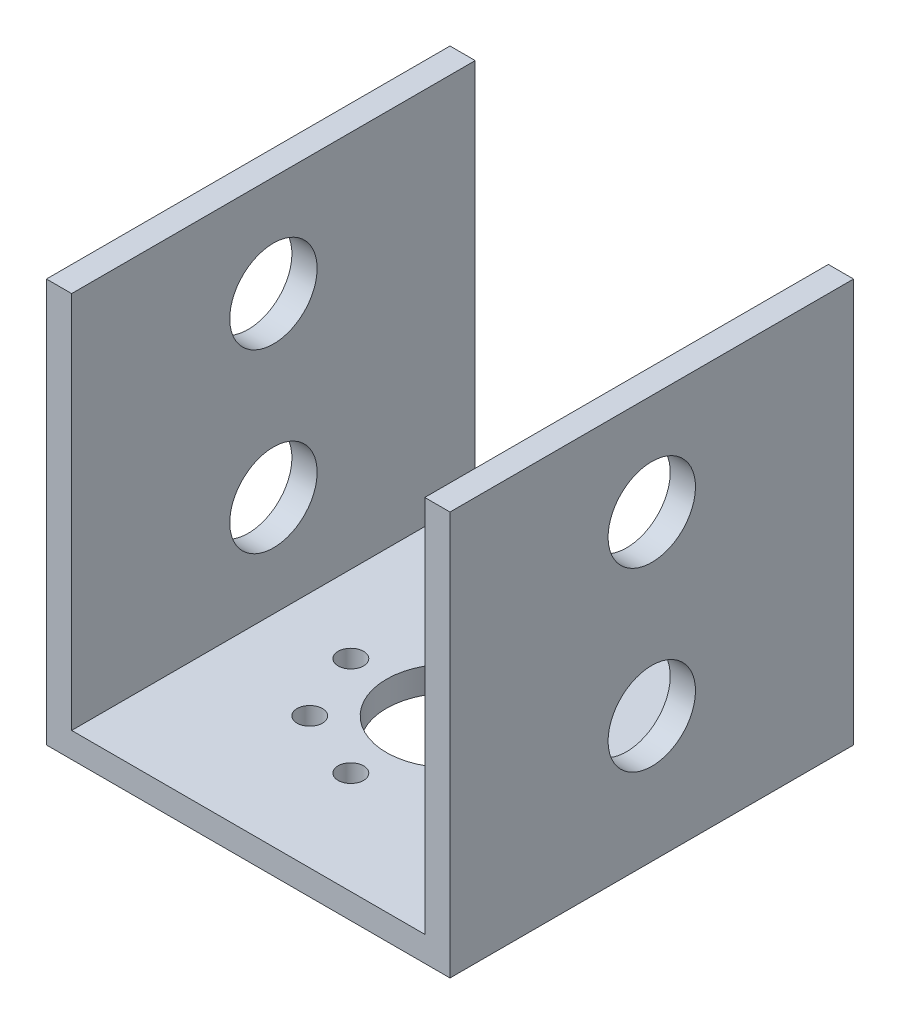
ISO-10303-21;
HEADER;
FILE_DESCRIPTION(('STEP AP214'),'2;1');
FILE_NAME('part.step','',(''),(''),'','','');
FILE_SCHEMA(('AUTOMOTIVE_DESIGN { 1 0 10303 214 1 1 1 1 }'));
ENDSEC;
DATA;
#1=APPLICATION_CONTEXT('core data for automotive mechanical design processes');
#2=APPLICATION_PROTOCOL_DEFINITION('international standard','automotive_design',2000,#1);
#3=PRODUCT_CONTEXT('',#1,'mechanical');
#4=PRODUCT('Part','Part','',(#3));
#5=PRODUCT_RELATED_PRODUCT_CATEGORY('part','',(#4));
#6=PRODUCT_DEFINITION_FORMATION('','',#4);
#7=PRODUCT_DEFINITION_CONTEXT('part definition',#1,'design');
#8=PRODUCT_DEFINITION('design','',#6,#7);
#9=PRODUCT_DEFINITION_SHAPE('','',#8);
#10=(LENGTH_UNIT() NAMED_UNIT(*) SI_UNIT(.MILLI.,.METRE.));
#11=(NAMED_UNIT(*) PLANE_ANGLE_UNIT() SI_UNIT($,.RADIAN.));
#12=(NAMED_UNIT(*) SI_UNIT($,.STERADIAN.) SOLID_ANGLE_UNIT());
#13=UNCERTAINTY_MEASURE_WITH_UNIT(LENGTH_MEASURE(1.E-05),#10,'distance_accuracy_value','');
#14=(GEOMETRIC_REPRESENTATION_CONTEXT(3) GLOBAL_UNCERTAINTY_ASSIGNED_CONTEXT((#13)) GLOBAL_UNIT_ASSIGNED_CONTEXT((#10,
#11,#12)) REPRESENTATION_CONTEXT('',''));
#15=CARTESIAN_POINT('',(0.,0.,0.));
#16=DIRECTION('',(0.,0.,1.));
#17=DIRECTION('',(1.,0.,0.));
#18=AXIS2_PLACEMENT_3D('',#15,#16,#17);
#19=CARTESIAN_POINT('',(11.1125,0.,25.4));
#20=DIRECTION('',(1.,0.,0.));
#21=DIRECTION('',(0.,0.,-1.));
#22=AXIS2_PLACEMENT_3D('',#19,#20,#21);
#23=PLANE('',#22);
#24=CARTESIAN_POINT('',(11.1125,17.4625,12.7));
#25=DIRECTION('',(1.,0.,0.));
#26=DIRECTION('',(0.,0.,-1.));
#27=AXIS2_PLACEMENT_3D('',#24,#25,#26);
#28=CIRCLE('',#27,2.75);
#29=CARTESIAN_POINT('',(11.1125,20.2125,12.7));
#30=VERTEX_POINT('',#29);
#31=EDGE_CURVE('E141',#30,#30,#28,.T.);
#32=ORIENTED_EDGE('',*,*,#31,.T.);
#33=EDGE_LOOP('',(#32));
#34=FACE_BOUND('',#33,.T.);
#35=CARTESIAN_POINT('',(11.1125,6.35,12.7));
#36=DIRECTION('',(1.,0.,0.));
#37=DIRECTION('',(0.,0.,-1.));
#38=AXIS2_PLACEMENT_3D('',#35,#36,#37);
#39=CIRCLE('',#38,2.75);
#40=CARTESIAN_POINT('',(11.1125,9.1,12.7));
#41=VERTEX_POINT('',#40);
#42=EDGE_CURVE('E190',#41,#41,#39,.T.);
#43=ORIENTED_EDGE('',*,*,#42,.T.);
#44=EDGE_LOOP('',(#43));
#45=FACE_BOUND('',#44,.T.);
#46=DIRECTION('',(0.,-1.,0.));
#47=VECTOR('',#46,1.);
#48=CARTESIAN_POINT('',(11.1125,0.,0.));
#49=LINE('',#48,#47);
#50=CARTESIAN_POINT('',(11.1125,23.8125,0.));
#51=VERTEX_POINT('',#50);
#52=CARTESIAN_POINT('',(11.1125,0.,0.));
#53=VERTEX_POINT('',#52);
#54=EDGE_CURVE('E137',#51,#53,#49,.T.);
#55=ORIENTED_EDGE('',*,*,#54,.T.);
#56=DIRECTION('',(0.,0.,-1.));
#57=VECTOR('',#56,1.);
#58=CARTESIAN_POINT('',(11.1125,0.,25.4));
#59=LINE('',#58,#57);
#60=CARTESIAN_POINT('',(11.1125,0.,25.4));
#61=VERTEX_POINT('',#60);
#62=EDGE_CURVE('E11',#61,#53,#59,.T.);
#63=ORIENTED_EDGE('',*,*,#62,.F.);
#64=DIRECTION('',(0.,-1.,0.));
#65=VECTOR('',#64,1.);
#66=CARTESIAN_POINT('',(11.1125,0.,25.4));
#67=LINE('',#66,#65);
#68=CARTESIAN_POINT('',(11.1125,23.8125,25.4));
#69=VERTEX_POINT('',#68);
#70=EDGE_CURVE('E152',#69,#61,#67,.T.);
#71=ORIENTED_EDGE('',*,*,#70,.F.);
#72=DIRECTION('',(0.,0.,-1.));
#73=VECTOR('',#72,1.);
#74=CARTESIAN_POINT('',(11.1125,23.8125,25.4));
#75=LINE('',#74,#73);
#76=EDGE_CURVE('E133',#69,#51,#75,.T.);
#77=ORIENTED_EDGE('',*,*,#76,.T.);
#78=EDGE_LOOP('',(#55,#63,#71,#77));
#79=FACE_BOUND('',#78,.T.);
#80=ADVANCED_FACE('F41',(#34,#45,#79),#23,.F.);
#81=CARTESIAN_POINT('',(-11.1125,0.,25.4));
#82=DIRECTION('',(0.,-1.,0.));
#83=DIRECTION('',(1.,0.,0.));
#84=AXIS2_PLACEMENT_3D('',#81,#82,#83);
#85=PLANE('',#84);
#86=CARTESIAN_POINT('',(0.,0.,6.45832603632909));
#87=DIRECTION('',(0.,1.,0.));
#88=DIRECTION('',(0.,0.,1.));
#89=AXIS2_PLACEMENT_3D('',#86,#87,#88);
#90=CIRCLE('',#89,0.799999999999999);
#91=CARTESIAN_POINT('',(0.,0.,7.25832603632909));
#92=VERTEX_POINT('',#91);
#93=EDGE_CURVE('E259',#92,#92,#90,.T.);
#94=ORIENTED_EDGE('',*,*,#93,.F.);
#95=EDGE_LOOP('',(#94));
#96=FACE_BOUND('',#95,.T.);
#97=CARTESIAN_POINT('',(4.41352998566722,0.,8.28647001433277));
#98=DIRECTION('',(0.,1.,0.));
#99=DIRECTION('',(0.,0.,1.));
#100=AXIS2_PLACEMENT_3D('',#97,#98,#99);
#101=CIRCLE('',#100,0.799999999999999);
#102=CARTESIAN_POINT('',(4.41352998566722,0.,9.08647001433277));
#103=VERTEX_POINT('',#102);
#104=EDGE_CURVE('E253',#103,#103,#101,.T.);
#105=ORIENTED_EDGE('',*,*,#104,.F.);
#106=EDGE_LOOP('',(#105));
#107=FACE_BOUND('',#106,.T.);
#108=CARTESIAN_POINT('',(6.24167396367092,0.,12.7));
#109=DIRECTION('',(0.,1.,0.));
#110=DIRECTION('',(0.,0.,1.));
#111=AXIS2_PLACEMENT_3D('',#108,#109,#110);
#112=CIRCLE('',#111,0.799999999999999);
#113=CARTESIAN_POINT('',(6.24167396367092,0.,13.5));
#114=VERTEX_POINT('',#113);
#115=EDGE_CURVE('E247',#114,#114,#112,.T.);
#116=ORIENTED_EDGE('',*,*,#115,.F.);
#117=EDGE_LOOP('',(#116));
#118=FACE_BOUND('',#117,.T.);
#119=CARTESIAN_POINT('',(4.41352998566722,0.,17.1135299856672));
#120=DIRECTION('',(0.,1.,0.));
#121=DIRECTION('',(0.,0.,1.));
#122=AXIS2_PLACEMENT_3D('',#119,#120,#121);
#123=CIRCLE('',#122,0.799999999999999);
#124=CARTESIAN_POINT('',(4.41352998566722,0.,17.9135299856672));
#125=VERTEX_POINT('',#124);
#126=EDGE_CURVE('E241',#125,#125,#123,.T.);
#127=ORIENTED_EDGE('',*,*,#126,.F.);
#128=EDGE_LOOP('',(#127));
#129=FACE_BOUND('',#128,.T.);
#130=CARTESIAN_POINT('',(0.,0.,18.9416739636709));
#131=DIRECTION('',(0.,1.,0.));
#132=DIRECTION('',(0.,0.,1.));
#133=AXIS2_PLACEMENT_3D('',#130,#131,#132);
#134=CIRCLE('',#133,0.799999999999999);
#135=CARTESIAN_POINT('',(0.,0.,19.7416739636709));
#136=VERTEX_POINT('',#135);
#137=EDGE_CURVE('E235',#136,#136,#134,.T.);
#138=ORIENTED_EDGE('',*,*,#137,.F.);
#139=EDGE_LOOP('',(#138));
#140=FACE_BOUND('',#139,.T.);
#141=CARTESIAN_POINT('',(-4.41352998566721,0.,17.1135299856672));
#142=DIRECTION('',(0.,1.,0.));
#143=DIRECTION('',(0.,0.,1.));
#144=AXIS2_PLACEMENT_3D('',#141,#142,#143);
#145=CIRCLE('',#144,0.799999999999999);
#146=CARTESIAN_POINT('',(-4.41352998566721,0.,17.9135299856672));
#147=VERTEX_POINT('',#146);
#148=EDGE_CURVE('E229',#147,#147,#145,.T.);
#149=ORIENTED_EDGE('',*,*,#148,.F.);
#150=EDGE_LOOP('',(#149));
#151=FACE_BOUND('',#150,.T.);
#152=CARTESIAN_POINT('',(-6.24167396367091,0.,12.7));
#153=DIRECTION('',(0.,1.,0.));
#154=DIRECTION('',(0.,0.,1.));
#155=AXIS2_PLACEMENT_3D('',#152,#153,#154);
#156=CIRCLE('',#155,0.799999999999999);
#157=CARTESIAN_POINT('',(-6.24167396367091,0.,13.5));
#158=VERTEX_POINT('',#157);
#159=EDGE_CURVE('E223',#158,#158,#156,.T.);
#160=ORIENTED_EDGE('',*,*,#159,.F.);
#161=EDGE_LOOP('',(#160));
#162=FACE_BOUND('',#161,.T.);
#163=CARTESIAN_POINT('',(-4.41352998566722,0.,8.28647001433278));
#164=DIRECTION('',(0.,1.,0.));
#165=DIRECTION('',(0.,0.,1.));
#166=AXIS2_PLACEMENT_3D('',#163,#164,#165);
#167=CIRCLE('',#166,0.799999999999999);
#168=CARTESIAN_POINT('',(-4.41352998566722,0.,9.08647001433278));
#169=VERTEX_POINT('',#168);
#170=EDGE_CURVE('E217',#169,#169,#167,.T.);
#171=ORIENTED_EDGE('',*,*,#170,.F.);
#172=EDGE_LOOP('',(#171));
#173=FACE_BOUND('',#172,.T.);
#174=CARTESIAN_POINT('',(0.,0.,12.7));
#175=DIRECTION('',(0.,1.,0.));
#176=DIRECTION('',(-1.,0.,0.));
#177=AXIS2_PLACEMENT_3D('',#174,#175,#176);
#178=CIRCLE('',#177,4.);
#179=CARTESIAN_POINT('',(-3.99999999999999,0.,12.7));
#180=VERTEX_POINT('',#179);
#181=EDGE_CURVE('E209',#180,#180,#178,.T.);
#182=ORIENTED_EDGE('',*,*,#181,.F.);
#183=EDGE_LOOP('',(#182));
#184=FACE_BOUND('',#183,.T.);
#185=DIRECTION('',(-1.,0.,0.));
#186=VECTOR('',#185,1.);
#187=CARTESIAN_POINT('',(-11.1125,0.,0.));
#188=LINE('',#187,#186);
#189=CARTESIAN_POINT('',(-11.1125,0.,0.));
#190=VERTEX_POINT('',#189);
#191=EDGE_CURVE('E140',#53,#190,#188,.T.);
#192=ORIENTED_EDGE('',*,*,#191,.T.);
#193=DIRECTION('',(0.,0.,-1.));
#194=VECTOR('',#193,1.);
#195=CARTESIAN_POINT('',(-11.1125,0.,25.4));
#196=LINE('',#195,#194);
#197=CARTESIAN_POINT('',(-11.1125,0.,25.4));
#198=VERTEX_POINT('',#197);
#199=EDGE_CURVE('E49',#198,#190,#196,.T.);
#200=ORIENTED_EDGE('',*,*,#199,.F.);
#201=DIRECTION('',(-1.,0.,0.));
#202=VECTOR('',#201,1.);
#203=CARTESIAN_POINT('',(-11.1125,0.,25.4));
#204=LINE('',#203,#202);
#205=EDGE_CURVE('E100',#61,#198,#204,.T.);
#206=ORIENTED_EDGE('',*,*,#205,.F.);
#207=ORIENTED_EDGE('',*,*,#62,.T.);
#208=EDGE_LOOP('',(#192,#200,#206,#207));
#209=FACE_BOUND('',#208,.T.);
#210=ADVANCED_FACE('F265',(#96,#107,#118,#129,#140,#151,#162,#173,#184,#209),#85,.F.);
#211=CARTESIAN_POINT('',(-11.1125,0.,25.4));
#212=DIRECTION('',(-1.,0.,0.));
#213=DIRECTION('',(0.,0.,1.));
#214=AXIS2_PLACEMENT_3D('',#211,#212,#213);
#215=PLANE('',#214);
#216=CARTESIAN_POINT('',(-11.1125,17.4625,12.7));
#217=DIRECTION('',(-1.,0.,0.));
#218=DIRECTION('',(0.,0.,1.));
#219=AXIS2_PLACEMENT_3D('',#216,#217,#218);
#220=CIRCLE('',#219,2.75);
#221=CARTESIAN_POINT('',(-11.1125,20.2125,12.7));
#222=VERTEX_POINT('',#221);
#223=EDGE_CURVE('E187',#222,#222,#220,.T.);
#224=ORIENTED_EDGE('',*,*,#223,.T.);
#225=EDGE_LOOP('',(#224));
#226=FACE_BOUND('',#225,.T.);
#227=CARTESIAN_POINT('',(-11.1125,6.35,12.7));
#228=DIRECTION('',(-1.,0.,0.));
#229=DIRECTION('',(0.,0.,1.));
#230=AXIS2_PLACEMENT_3D('',#227,#228,#229);
#231=CIRCLE('',#230,2.75);
#232=CARTESIAN_POINT('',(-11.1125,9.09999999999999,12.7));
#233=VERTEX_POINT('',#232);
#234=EDGE_CURVE('E193',#233,#233,#231,.T.);
#235=ORIENTED_EDGE('',*,*,#234,.T.);
#236=EDGE_LOOP('',(#235));
#237=FACE_BOUND('',#236,.T.);
#238=DIRECTION('',(0.,1.,0.));
#239=VECTOR('',#238,1.);
#240=CARTESIAN_POINT('',(-11.1125,0.,0.));
#241=LINE('',#240,#239);
#242=CARTESIAN_POINT('',(-11.1125,23.8125,0.));
#243=VERTEX_POINT('',#242);
#244=EDGE_CURVE('E143',#190,#243,#241,.T.);
#245=ORIENTED_EDGE('',*,*,#244,.T.);
#246=DIRECTION('',(0.,0.,-1.));
#247=VECTOR('',#246,1.);
#248=CARTESIAN_POINT('',(-11.1125,23.8125,25.4));
#249=LINE('',#248,#247);
#250=CARTESIAN_POINT('',(-11.1125,23.8125,25.4));
#251=VERTEX_POINT('',#250);
#252=EDGE_CURVE('E159',#251,#243,#249,.T.);
#253=ORIENTED_EDGE('',*,*,#252,.F.);
#254=DIRECTION('',(0.,1.,0.));
#255=VECTOR('',#254,1.);
#256=CARTESIAN_POINT('',(-11.1125,0.,25.4));
#257=LINE('',#256,#255);
#258=EDGE_CURVE('E167',#198,#251,#257,.T.);
#259=ORIENTED_EDGE('',*,*,#258,.F.);
#260=ORIENTED_EDGE('',*,*,#199,.T.);
#261=EDGE_LOOP('',(#245,#253,#259,#260));
#262=FACE_BOUND('',#261,.T.);
#263=ADVANCED_FACE('F165',(#226,#237,#262),#215,.F.);
#264=CARTESIAN_POINT('',(-11.1125,23.8125,25.4));
#265=DIRECTION('',(0.,-1.,0.));
#266=DIRECTION('',(0.,0.,-1.));
#267=AXIS2_PLACEMENT_3D('',#264,#265,#266);
#268=PLANE('',#267);
#269=DIRECTION('',(-1.,0.,0.));
#270=VECTOR('',#269,1.);
#271=CARTESIAN_POINT('',(-11.1125,23.8125,0.));
#272=LINE('',#271,#270);
#273=CARTESIAN_POINT('',(-12.7,23.8125,0.));
#274=VERTEX_POINT('',#273);
#275=EDGE_CURVE('E145',#243,#274,#272,.T.);
#276=ORIENTED_EDGE('',*,*,#275,.T.);
#277=DIRECTION('',(0.,0.,-1.));
#278=VECTOR('',#277,1.);
#279=CARTESIAN_POINT('',(-12.7,23.8125,25.4));
#280=LINE('',#279,#278);
#281=CARTESIAN_POINT('',(-12.7,23.8125,25.4));
#282=VERTEX_POINT('',#281);
#283=EDGE_CURVE('E156',#282,#274,#280,.T.);
#284=ORIENTED_EDGE('',*,*,#283,.F.);
#285=DIRECTION('',(-1.,0.,0.));
#286=VECTOR('',#285,1.);
#287=CARTESIAN_POINT('',(-11.1125,23.8125,25.4));
#288=LINE('',#287,#286);
#289=EDGE_CURVE('E179',#251,#282,#288,.T.);
#290=ORIENTED_EDGE('',*,*,#289,.F.);
#291=ORIENTED_EDGE('',*,*,#252,.T.);
#292=EDGE_LOOP('',(#276,#284,#290,#291));
#293=FACE_BOUND('',#292,.T.);
#294=ADVANCED_FACE('F175',(#293),#268,.F.);
#295=CARTESIAN_POINT('',(-12.7,-1.5875,25.4));
#296=DIRECTION('',(1.,0.,0.));
#297=DIRECTION('',(0.,0.,-1.));
#298=AXIS2_PLACEMENT_3D('',#295,#296,#297);
#299=PLANE('',#298);
#300=CARTESIAN_POINT('',(-12.7,17.4625,12.7));
#301=DIRECTION('',(1.,0.,0.));
#302=DIRECTION('',(0.,1.,0.));
#303=AXIS2_PLACEMENT_3D('',#300,#301,#302);
#304=CIRCLE('',#303,2.75);
#305=CARTESIAN_POINT('',(-12.7,20.2125,12.7));
#306=VERTEX_POINT('',#305);
#307=EDGE_CURVE('E196',#306,#306,#304,.T.);
#308=ORIENTED_EDGE('',*,*,#307,.T.);
#309=EDGE_LOOP('',(#308));
#310=FACE_BOUND('',#309,.T.);
#311=CARTESIAN_POINT('',(-12.7,6.34999999999999,12.7));
#312=DIRECTION('',(1.,0.,0.));
#313=DIRECTION('',(0.,1.,0.));
#314=AXIS2_PLACEMENT_3D('',#311,#312,#313);
#315=CIRCLE('',#314,2.75);
#316=CARTESIAN_POINT('',(-12.7,9.09999999999999,12.7));
#317=VERTEX_POINT('',#316);
#318=EDGE_CURVE('E197',#317,#317,#315,.T.);
#319=ORIENTED_EDGE('',*,*,#318,.T.);
#320=EDGE_LOOP('',(#319));
#321=FACE_BOUND('',#320,.T.);
#322=DIRECTION('',(0.,-1.,0.));
#323=VECTOR('',#322,1.);
#324=CARTESIAN_POINT('',(-12.7,-1.5875,0.));
#325=LINE('',#324,#323);
#326=CARTESIAN_POINT('',(-12.7,-1.5875,0.));
#327=VERTEX_POINT('',#326);
#328=EDGE_CURVE('E147',#274,#327,#325,.T.);
#329=ORIENTED_EDGE('',*,*,#328,.T.);
#330=DIRECTION('',(0.,0.,-1.));
#331=VECTOR('',#330,1.);
#332=CARTESIAN_POINT('',(-12.7,-1.5875,25.4));
#333=LINE('',#332,#331);
#334=CARTESIAN_POINT('',(-12.7,-1.5875,25.4));
#335=VERTEX_POINT('',#334);
#336=EDGE_CURVE('E128',#335,#327,#333,.T.);
#337=ORIENTED_EDGE('',*,*,#336,.F.);
#338=DIRECTION('',(0.,-1.,0.));
#339=VECTOR('',#338,1.);
#340=CARTESIAN_POINT('',(-12.7,-1.5875,25.4));
#341=LINE('',#340,#339);
#342=EDGE_CURVE('E119',#282,#335,#341,.T.);
#343=ORIENTED_EDGE('',*,*,#342,.F.);
#344=ORIENTED_EDGE('',*,*,#283,.T.);
#345=EDGE_LOOP('',(#329,#337,#343,#344));
#346=FACE_BOUND('',#345,.T.);
#347=ADVANCED_FACE('F178',(#310,#321,#346),#299,.F.);
#348=CARTESIAN_POINT('',(-12.7,-1.5875,25.4));
#349=DIRECTION('',(0.,1.,0.));
#350=DIRECTION('',(-1.,0.,0.));
#351=AXIS2_PLACEMENT_3D('',#348,#349,#350);
#352=PLANE('',#351);
#353=CARTESIAN_POINT('',(0.,-1.58750000000001,6.45832603632909));
#354=DIRECTION('',(0.,1.,0.));
#355=DIRECTION('',(0.,0.,1.));
#356=AXIS2_PLACEMENT_3D('',#353,#354,#355);
#357=CIRCLE('',#356,0.799999999999999);
#358=CARTESIAN_POINT('',(0.,-1.58750000000001,7.25832603632909));
#359=VERTEX_POINT('',#358);
#360=EDGE_CURVE('E256',#359,#359,#357,.T.);
#361=ORIENTED_EDGE('',*,*,#360,.T.);
#362=EDGE_LOOP('',(#361));
#363=FACE_BOUND('',#362,.T.);
#364=CARTESIAN_POINT('',(4.41352998566722,-1.5875,8.28647001433277));
#365=DIRECTION('',(0.,1.,0.));
#366=DIRECTION('',(0.,0.,1.));
#367=AXIS2_PLACEMENT_3D('',#364,#365,#366);
#368=CIRCLE('',#367,0.799999999999999);
#369=CARTESIAN_POINT('',(4.41352998566722,-1.5875,9.08647001433277));
#370=VERTEX_POINT('',#369);
#371=EDGE_CURVE('E250',#370,#370,#368,.T.);
#372=ORIENTED_EDGE('',*,*,#371,.T.);
#373=EDGE_LOOP('',(#372));
#374=FACE_BOUND('',#373,.T.);
#375=CARTESIAN_POINT('',(6.24167396367092,-1.5875,12.7));
#376=DIRECTION('',(0.,1.,0.));
#377=DIRECTION('',(0.,0.,1.));
#378=AXIS2_PLACEMENT_3D('',#375,#376,#377);
#379=CIRCLE('',#378,0.799999999999999);
#380=CARTESIAN_POINT('',(6.24167396367092,-1.5875,13.5));
#381=VERTEX_POINT('',#380);
#382=EDGE_CURVE('E244',#381,#381,#379,.T.);
#383=ORIENTED_EDGE('',*,*,#382,.T.);
#384=EDGE_LOOP('',(#383));
#385=FACE_BOUND('',#384,.T.);
#386=CARTESIAN_POINT('',(4.41352998566722,-1.5875,17.1135299856672));
#387=DIRECTION('',(0.,1.,0.));
#388=DIRECTION('',(0.,0.,1.));
#389=AXIS2_PLACEMENT_3D('',#386,#387,#388);
#390=CIRCLE('',#389,0.799999999999999);
#391=CARTESIAN_POINT('',(4.41352998566722,-1.5875,17.9135299856672));
#392=VERTEX_POINT('',#391);
#393=EDGE_CURVE('E238',#392,#392,#390,.T.);
#394=ORIENTED_EDGE('',*,*,#393,.T.);
#395=EDGE_LOOP('',(#394));
#396=FACE_BOUND('',#395,.T.);
#397=CARTESIAN_POINT('',(0.,-1.58750000000001,18.9416739636709));
#398=DIRECTION('',(0.,1.,0.));
#399=DIRECTION('',(0.,0.,1.));
#400=AXIS2_PLACEMENT_3D('',#397,#398,#399);
#401=CIRCLE('',#400,0.799999999999999);
#402=CARTESIAN_POINT('',(0.,-1.58750000000001,19.7416739636709));
#403=VERTEX_POINT('',#402);
#404=EDGE_CURVE('E232',#403,#403,#401,.T.);
#405=ORIENTED_EDGE('',*,*,#404,.T.);
#406=EDGE_LOOP('',(#405));
#407=FACE_BOUND('',#406,.T.);
#408=CARTESIAN_POINT('',(-4.41352998566721,-1.58750000000001,17.1135299856672));
#409=DIRECTION('',(0.,1.,0.));
#410=DIRECTION('',(0.,0.,1.));
#411=AXIS2_PLACEMENT_3D('',#408,#409,#410);
#412=CIRCLE('',#411,0.799999999999999);
#413=CARTESIAN_POINT('',(-4.41352998566721,-1.58750000000001,17.9135299856672));
#414=VERTEX_POINT('',#413);
#415=EDGE_CURVE('E226',#414,#414,#412,.T.);
#416=ORIENTED_EDGE('',*,*,#415,.T.);
#417=EDGE_LOOP('',(#416));
#418=FACE_BOUND('',#417,.T.);
#419=CARTESIAN_POINT('',(-6.24167396367091,-1.58750000000001,12.7));
#420=DIRECTION('',(0.,1.,0.));
#421=DIRECTION('',(0.,0.,1.));
#422=AXIS2_PLACEMENT_3D('',#419,#420,#421);
#423=CIRCLE('',#422,0.799999999999999);
#424=CARTESIAN_POINT('',(-6.24167396367091,-1.58750000000001,13.5));
#425=VERTEX_POINT('',#424);
#426=EDGE_CURVE('E220',#425,#425,#423,.T.);
#427=ORIENTED_EDGE('',*,*,#426,.T.);
#428=EDGE_LOOP('',(#427));
#429=FACE_BOUND('',#428,.T.);
#430=CARTESIAN_POINT('',(-4.41352998566722,-1.58750000000001,8.28647001433278));
#431=DIRECTION('',(0.,1.,0.));
#432=DIRECTION('',(0.,0.,1.));
#433=AXIS2_PLACEMENT_3D('',#430,#431,#432);
#434=CIRCLE('',#433,0.799999999999999);
#435=CARTESIAN_POINT('',(-4.41352998566722,-1.58750000000001,9.08647001433278));
#436=VERTEX_POINT('',#435);
#437=EDGE_CURVE('E212',#436,#436,#434,.T.);
#438=ORIENTED_EDGE('',*,*,#437,.T.);
#439=EDGE_LOOP('',(#438));
#440=FACE_BOUND('',#439,.T.);
#441=CARTESIAN_POINT('',(0.,-1.5875,12.7));
#442=DIRECTION('',(0.,1.,0.));
#443=DIRECTION('',(-1.,0.,0.));
#444=AXIS2_PLACEMENT_3D('',#441,#442,#443);
#445=CIRCLE('',#444,4.);
#446=CARTESIAN_POINT('',(-3.99999999999999,-1.5875,12.7));
#447=VERTEX_POINT('',#446);
#448=EDGE_CURVE('E201',#447,#447,#445,.T.);
#449=ORIENTED_EDGE('',*,*,#448,.T.);
#450=EDGE_LOOP('',(#449));
#451=FACE_BOUND('',#450,.T.);
#452=DIRECTION('',(1.,0.,0.));
#453=VECTOR('',#452,1.);
#454=CARTESIAN_POINT('',(-12.7,-1.5875,0.));
#455=LINE('',#454,#453);
#456=CARTESIAN_POINT('',(12.7,-1.5875,0.));
#457=VERTEX_POINT('',#456);
#458=EDGE_CURVE('E127',#327,#457,#455,.T.);
#459=ORIENTED_EDGE('',*,*,#458,.T.);
#460=DIRECTION('',(0.,0.,-1.));
#461=VECTOR('',#460,1.);
#462=CARTESIAN_POINT('',(12.7,-1.5875,25.4));
#463=LINE('',#462,#461);
#464=CARTESIAN_POINT('',(12.7,-1.5875,25.4));
#465=VERTEX_POINT('',#464);
#466=EDGE_CURVE('E124',#465,#457,#463,.T.);
#467=ORIENTED_EDGE('',*,*,#466,.F.);
#468=DIRECTION('',(1.,0.,0.));
#469=VECTOR('',#468,1.);
#470=CARTESIAN_POINT('',(-12.7,-1.5875,25.4));
#471=LINE('',#470,#469);
#472=EDGE_CURVE('E113',#335,#465,#471,.T.);
#473=ORIENTED_EDGE('',*,*,#472,.F.);
#474=ORIENTED_EDGE('',*,*,#336,.T.);
#475=EDGE_LOOP('',(#459,#467,#473,#474));
#476=FACE_BOUND('',#475,.T.);
#477=ADVANCED_FACE('F125',(#363,#374,#385,#396,#407,#418,#429,#440,#451,#476),#352,.F.);
#478=CARTESIAN_POINT('',(12.7,-1.5875,25.4));
#479=DIRECTION('',(-1.,0.,0.));
#480=DIRECTION('',(0.,-1.,0.));
#481=AXIS2_PLACEMENT_3D('',#478,#479,#480);
#482=PLANE('',#481);
#483=CARTESIAN_POINT('',(12.7,17.4625,12.7));
#484=DIRECTION('',(1.,0.,0.));
#485=DIRECTION('',(0.,1.,0.));
#486=AXIS2_PLACEMENT_3D('',#483,#484,#485);
#487=CIRCLE('',#486,2.75);
#488=CARTESIAN_POINT('',(12.7,20.2125,12.7));
#489=VERTEX_POINT('',#488);
#490=EDGE_CURVE('E204',#489,#489,#487,.T.);
#491=ORIENTED_EDGE('',*,*,#490,.F.);
#492=EDGE_LOOP('',(#491));
#493=FACE_BOUND('',#492,.T.);
#494=CARTESIAN_POINT('',(12.7,6.35,12.7));
#495=DIRECTION('',(1.,0.,0.));
#496=DIRECTION('',(0.,1.,0.));
#497=AXIS2_PLACEMENT_3D('',#494,#495,#496);
#498=CIRCLE('',#497,2.75);
#499=CARTESIAN_POINT('',(12.7,9.1,12.7));
#500=VERTEX_POINT('',#499);
#501=EDGE_CURVE('E200',#500,#500,#498,.T.);
#502=ORIENTED_EDGE('',*,*,#501,.F.);
#503=EDGE_LOOP('',(#502));
#504=FACE_BOUND('',#503,.T.);
#505=DIRECTION('',(0.,1.,0.));
#506=VECTOR('',#505,1.);
#507=CARTESIAN_POINT('',(12.7,-1.5875,0.));
#508=LINE('',#507,#506);
#509=CARTESIAN_POINT('',(12.7,23.8125,0.));
#510=VERTEX_POINT('',#509);
#511=EDGE_CURVE('E86',#457,#510,#508,.T.);
#512=ORIENTED_EDGE('',*,*,#511,.T.);
#513=DIRECTION('',(0.,0.,-1.));
#514=VECTOR('',#513,1.);
#515=CARTESIAN_POINT('',(12.7,23.8125,25.4));
#516=LINE('',#515,#514);
#517=CARTESIAN_POINT('',(12.7,23.8125,25.4));
#518=VERTEX_POINT('',#517);
#519=EDGE_CURVE('E129',#518,#510,#516,.T.);
#520=ORIENTED_EDGE('',*,*,#519,.F.);
#521=DIRECTION('',(0.,1.,0.));
#522=VECTOR('',#521,1.);
#523=CARTESIAN_POINT('',(12.7,-1.5875,25.4));
#524=LINE('',#523,#522);
#525=EDGE_CURVE('E117',#465,#518,#524,.T.);
#526=ORIENTED_EDGE('',*,*,#525,.F.);
#527=ORIENTED_EDGE('',*,*,#466,.T.);
#528=EDGE_LOOP('',(#512,#520,#526,#527));
#529=FACE_BOUND('',#528,.T.);
#530=ADVANCED_FACE('F131',(#493,#504,#529),#482,.F.);
#531=CARTESIAN_POINT('',(11.1125,23.8125,25.4));
#532=DIRECTION('',(0.,-1.,0.));
#533=DIRECTION('',(0.,0.,-1.));
#534=AXIS2_PLACEMENT_3D('',#531,#532,#533);
#535=PLANE('',#534);
#536=DIRECTION('',(-1.,0.,0.));
#537=VECTOR('',#536,1.);
#538=CARTESIAN_POINT('',(11.1125,23.8125,0.));
#539=LINE('',#538,#537);
#540=EDGE_CURVE('E92',#510,#51,#539,.T.);
#541=ORIENTED_EDGE('',*,*,#540,.T.);
#542=ORIENTED_EDGE('',*,*,#76,.F.);
#543=DIRECTION('',(-1.,0.,0.));
#544=VECTOR('',#543,1.);
#545=CARTESIAN_POINT('',(11.1125,23.8125,25.4));
#546=LINE('',#545,#544);
#547=EDGE_CURVE('E57',#518,#69,#546,.T.);
#548=ORIENTED_EDGE('',*,*,#547,.F.);
#549=ORIENTED_EDGE('',*,*,#519,.T.);
#550=EDGE_LOOP('',(#541,#542,#548,#549));
#551=FACE_BOUND('',#550,.T.);
#552=ADVANCED_FACE('F286',(#551),#535,.F.);
#553=CARTESIAN_POINT('',(0.,0.,25.4));
#554=DIRECTION('',(0.,0.,-1.));
#555=DIRECTION('',(-1.,0.,0.));
#556=AXIS2_PLACEMENT_3D('',#553,#554,#555);
#557=PLANE('',#556);
#558=ORIENTED_EDGE('',*,*,#70,.T.);
#559=ORIENTED_EDGE('',*,*,#205,.T.);
#560=ORIENTED_EDGE('',*,*,#258,.T.);
#561=ORIENTED_EDGE('',*,*,#289,.T.);
#562=ORIENTED_EDGE('',*,*,#342,.T.);
#563=ORIENTED_EDGE('',*,*,#472,.T.);
#564=ORIENTED_EDGE('',*,*,#525,.T.);
#565=ORIENTED_EDGE('',*,*,#547,.T.);
#566=EDGE_LOOP('',(#558,#559,#560,#561,#562,#563,#564,#565));
#567=FACE_BOUND('',#566,.T.);
#568=ADVANCED_FACE('F115',(#567),#557,.F.);
#569=CARTESIAN_POINT('',(0.,0.,0.));
#570=DIRECTION('',(0.,0.,-1.));
#571=DIRECTION('',(-1.,0.,0.));
#572=AXIS2_PLACEMENT_3D('',#569,#570,#571);
#573=PLANE('',#572);
#574=ORIENTED_EDGE('',*,*,#54,.F.);
#575=ORIENTED_EDGE('',*,*,#540,.F.);
#576=ORIENTED_EDGE('',*,*,#511,.F.);
#577=ORIENTED_EDGE('',*,*,#458,.F.);
#578=ORIENTED_EDGE('',*,*,#328,.F.);
#579=ORIENTED_EDGE('',*,*,#275,.F.);
#580=ORIENTED_EDGE('',*,*,#244,.F.);
#581=ORIENTED_EDGE('',*,*,#191,.F.);
#582=EDGE_LOOP('',(#574,#575,#576,#577,#578,#579,#580,#581));
#583=FACE_BOUND('',#582,.T.);
#584=ADVANCED_FACE('F171',(#583),#573,.T.);
#585=CARTESIAN_POINT('',(-12.7,6.34999999999999,12.7));
#586=DIRECTION('',(1.,0.,0.));
#587=DIRECTION('',(0.,1.,0.));
#588=AXIS2_PLACEMENT_3D('',#585,#586,#587);
#589=CYLINDRICAL_SURFACE('',#588,2.75);
#590=CARTESIAN_POINT('',(12.7,9.1,12.7));
#591=CARTESIAN_POINT('',(12.6834635416667,9.1,12.7));
#592=CARTESIAN_POINT('',(12.6669270833333,9.1,12.7));
#593=CARTESIAN_POINT('',(12.6338541666667,9.1,12.7));
#594=CARTESIAN_POINT('',(12.6173177083333,9.1,12.7));
#595=CARTESIAN_POINT('',(12.5842447916667,9.1,12.7));
#596=CARTESIAN_POINT('',(12.5677083333333,9.1,12.7));
#597=CARTESIAN_POINT('',(12.5346354166667,9.1,12.7));
#598=CARTESIAN_POINT('',(12.5180989583333,9.1,12.7));
#599=CARTESIAN_POINT('',(12.4850260416667,9.1,12.7));
#600=CARTESIAN_POINT('',(12.4684895833333,9.1,12.7));
#601=CARTESIAN_POINT('',(12.4354166666667,9.1,12.7));
#602=CARTESIAN_POINT('',(12.4188802083333,9.1,12.7));
#603=CARTESIAN_POINT('',(12.3858072916667,9.1,12.7));
#604=CARTESIAN_POINT('',(12.3692708333333,9.1,12.7));
#605=CARTESIAN_POINT('',(12.3361979166667,9.1,12.7));
#606=CARTESIAN_POINT('',(12.3196614583333,9.1,12.7));
#607=CARTESIAN_POINT('',(12.2865885416667,9.1,12.7));
#608=CARTESIAN_POINT('',(12.2700520833333,9.1,12.7));
#609=CARTESIAN_POINT('',(12.2369791666667,9.1,12.7));
#610=CARTESIAN_POINT('',(12.2204427083333,9.1,12.7));
#611=CARTESIAN_POINT('',(12.1873697916667,9.1,12.7));
#612=CARTESIAN_POINT('',(12.1708333333333,9.1,12.7));
#613=CARTESIAN_POINT('',(12.1377604166667,9.1,12.7));
#614=CARTESIAN_POINT('',(12.1212239583333,9.1,12.7));
#615=CARTESIAN_POINT('',(12.0881510416667,9.1,12.7));
#616=CARTESIAN_POINT('',(12.0716145833333,9.1,12.7));
#617=CARTESIAN_POINT('',(12.0385416666667,9.1,12.7));
#618=CARTESIAN_POINT('',(12.0220052083333,9.1,12.7));
#619=CARTESIAN_POINT('',(11.9889322916667,9.1,12.7));
#620=CARTESIAN_POINT('',(11.9723958333333,9.1,12.7));
#621=CARTESIAN_POINT('',(11.9393229166667,9.1,12.7));
#622=CARTESIAN_POINT('',(11.9227864583333,9.1,12.7));
#623=CARTESIAN_POINT('',(11.8897135416667,9.1,12.7));
#624=CARTESIAN_POINT('',(11.8731770833333,9.1,12.7));
#625=CARTESIAN_POINT('',(11.8401041666667,9.1,12.7));
#626=CARTESIAN_POINT('',(11.8235677083333,9.1,12.7));
#627=CARTESIAN_POINT('',(11.7904947916667,9.1,12.7));
#628=CARTESIAN_POINT('',(11.7739583333333,9.1,12.7));
#629=CARTESIAN_POINT('',(11.7408854166667,9.1,12.7));
#630=CARTESIAN_POINT('',(11.7243489583333,9.1,12.7));
#631=CARTESIAN_POINT('',(11.6912760416667,9.1,12.7));
#632=CARTESIAN_POINT('',(11.6747395833333,9.1,12.7));
#633=CARTESIAN_POINT('',(11.6416666666667,9.1,12.7));
#634=CARTESIAN_POINT('',(11.6251302083333,9.1,12.7));
#635=CARTESIAN_POINT('',(11.5920572916667,9.1,12.7));
#636=CARTESIAN_POINT('',(11.5755208333333,9.1,12.7));
#637=CARTESIAN_POINT('',(11.5424479166667,9.1,12.7));
#638=CARTESIAN_POINT('',(11.5259114583333,9.1,12.7));
#639=CARTESIAN_POINT('',(11.4928385416667,9.1,12.7));
#640=CARTESIAN_POINT('',(11.4763020833333,9.1,12.7));
#641=CARTESIAN_POINT('',(11.4432291666667,9.1,12.7));
#642=CARTESIAN_POINT('',(11.4266927083333,9.1,12.7));
#643=CARTESIAN_POINT('',(11.3936197916667,9.1,12.7));
#644=CARTESIAN_POINT('',(11.3770833333333,9.1,12.7));
#645=CARTESIAN_POINT('',(11.3440104166667,9.1,12.7));
#646=CARTESIAN_POINT('',(11.3274739583333,9.1,12.7));
#647=CARTESIAN_POINT('',(11.2944010416667,9.1,12.7));
#648=CARTESIAN_POINT('',(11.2778645833333,9.1,12.7));
#649=CARTESIAN_POINT('',(11.2447916666667,9.1,12.7));
#650=CARTESIAN_POINT('',(11.2282552083333,9.1,12.7));
#651=CARTESIAN_POINT('',(11.1951822916667,9.1,12.7));
#652=CARTESIAN_POINT('',(11.1786458333333,9.1,12.7));
#653=CARTESIAN_POINT('',(11.1455729166667,9.1,12.7));
#654=CARTESIAN_POINT('',(11.1290364583333,9.1,12.7));
#655=CARTESIAN_POINT('',(11.1125,9.1,12.7));
#656=B_SPLINE_CURVE_WITH_KNOTS('',3,(#590,#591,#592,#593,#594,#595,#596,#597,#598,#599,#600,
#601,#602,#603,#604,#605,#606,#607,#608,#609,#610,#611,#612,#613,#614,#615,#616,#617,#618,#619,
#620,#621,#622,#623,#624,#625,#626,#627,#628,#629,#630,#631,#632,#633,#634,#635,#636,#637,#638,
#639,#640,#641,#642,#643,#644,#645,#646,#647,#648,#649,#650,#651,#652,#653,#654,#655),
.UNSPECIFIED.,.F.,.F.,(4,2,2,2,2,2,2,2,2,2,2,2,2,2,2,2,2,2,2,2,2,2,2,2,2,2,2,2,2,2,2,2,4),(0.,
0.0496093749999989,0.0992187499999977,0.148828125,0.198437499999999,0.248046874999998,
0.29765625,0.347265624999999,0.396874999999998,0.446484374999997,0.496093749999996,
0.545703124999998,0.595312499999997,0.644921874999996,0.694531249999998,0.744140624999997,
0.793749999999996,0.843359374999995,0.892968749999994,0.942578124999996,0.992187499999995,
1.04179687499999,1.09140625,1.14101562499999,1.19062499999999,1.24023437499999,1.28984374999999,
1.33945312499999,1.38906249999999,1.43867187499999,1.48828124999999,1.53789062499999,
1.58749999999999),.UNSPECIFIED.);
#657=EDGE_CURVE('BSEAM305',#500,#41,#656,.T.);
#658=ORIENTED_EDGE('',*,*,#501,.T.);
#659=ORIENTED_EDGE('',*,*,#42,.F.);
#660=ORIENTED_EDGE('',*,*,#657,.T.);
#661=ORIENTED_EDGE('',*,*,#657,.F.);
#662=EDGE_LOOP('',(#658,#660,#659,#661));
#663=FACE_BOUND('',#662,.T.);
#664=ADVANCED_FACE('F305',(#663),#589,.F.);
#665=CARTESIAN_POINT('',(-12.7,17.4625,12.7));
#666=DIRECTION('',(1.,0.,0.));
#667=DIRECTION('',(0.,1.,0.));
#668=AXIS2_PLACEMENT_3D('',#665,#666,#667);
#669=CYLINDRICAL_SURFACE('',#668,2.75);
#670=CARTESIAN_POINT('',(12.7,20.2125,12.7));
#671=CARTESIAN_POINT('',(12.6834635416667,20.2125,12.7));
#672=CARTESIAN_POINT('',(12.6669270833333,20.2125,12.7));
#673=CARTESIAN_POINT('',(12.6338541666667,20.2125,12.7));
#674=CARTESIAN_POINT('',(12.6173177083333,20.2125,12.7));
#675=CARTESIAN_POINT('',(12.5842447916667,20.2125,12.7));
#676=CARTESIAN_POINT('',(12.5677083333333,20.2125,12.7));
#677=CARTESIAN_POINT('',(12.5346354166667,20.2125,12.7));
#678=CARTESIAN_POINT('',(12.5180989583333,20.2125,12.7));
#679=CARTESIAN_POINT('',(12.4850260416667,20.2125,12.7));
#680=CARTESIAN_POINT('',(12.4684895833333,20.2125,12.7));
#681=CARTESIAN_POINT('',(12.4354166666667,20.2125,12.7));
#682=CARTESIAN_POINT('',(12.4188802083333,20.2125,12.7));
#683=CARTESIAN_POINT('',(12.3858072916667,20.2125,12.7));
#684=CARTESIAN_POINT('',(12.3692708333333,20.2125,12.7));
#685=CARTESIAN_POINT('',(12.3361979166667,20.2125,12.7));
#686=CARTESIAN_POINT('',(12.3196614583333,20.2125,12.7));
#687=CARTESIAN_POINT('',(12.2865885416667,20.2125,12.7));
#688=CARTESIAN_POINT('',(12.2700520833333,20.2125,12.7));
#689=CARTESIAN_POINT('',(12.2369791666667,20.2125,12.7));
#690=CARTESIAN_POINT('',(12.2204427083333,20.2125,12.7));
#691=CARTESIAN_POINT('',(12.1873697916667,20.2125,12.7));
#692=CARTESIAN_POINT('',(12.1708333333333,20.2125,12.7));
#693=CARTESIAN_POINT('',(12.1377604166667,20.2125,12.7));
#694=CARTESIAN_POINT('',(12.1212239583333,20.2125,12.7));
#695=CARTESIAN_POINT('',(12.0881510416667,20.2125,12.7));
#696=CARTESIAN_POINT('',(12.0716145833333,20.2125,12.7));
#697=CARTESIAN_POINT('',(12.0385416666667,20.2125,12.7));
#698=CARTESIAN_POINT('',(12.0220052083333,20.2125,12.7));
#699=CARTESIAN_POINT('',(11.9889322916667,20.2125,12.7));
#700=CARTESIAN_POINT('',(11.9723958333333,20.2125,12.7));
#701=CARTESIAN_POINT('',(11.9393229166667,20.2125,12.7));
#702=CARTESIAN_POINT('',(11.9227864583333,20.2125,12.7));
#703=CARTESIAN_POINT('',(11.8897135416667,20.2125,12.7));
#704=CARTESIAN_POINT('',(11.8731770833333,20.2125,12.7));
#705=CARTESIAN_POINT('',(11.8401041666667,20.2125,12.7));
#706=CARTESIAN_POINT('',(11.8235677083333,20.2125,12.7));
#707=CARTESIAN_POINT('',(11.7904947916667,20.2125,12.7));
#708=CARTESIAN_POINT('',(11.7739583333333,20.2125,12.7));
#709=CARTESIAN_POINT('',(11.7408854166667,20.2125,12.7));
#710=CARTESIAN_POINT('',(11.7243489583333,20.2125,12.7));
#711=CARTESIAN_POINT('',(11.6912760416667,20.2125,12.7));
#712=CARTESIAN_POINT('',(11.6747395833333,20.2125,12.7));
#713=CARTESIAN_POINT('',(11.6416666666667,20.2125,12.7));
#714=CARTESIAN_POINT('',(11.6251302083333,20.2125,12.7));
#715=CARTESIAN_POINT('',(11.5920572916667,20.2125,12.7));
#716=CARTESIAN_POINT('',(11.5755208333333,20.2125,12.7));
#717=CARTESIAN_POINT('',(11.5424479166667,20.2125,12.7));
#718=CARTESIAN_POINT('',(11.5259114583333,20.2125,12.7));
#719=CARTESIAN_POINT('',(11.4928385416667,20.2125,12.7));
#720=CARTESIAN_POINT('',(11.4763020833333,20.2125,12.7));
#721=CARTESIAN_POINT('',(11.4432291666667,20.2125,12.7));
#722=CARTESIAN_POINT('',(11.4266927083333,20.2125,12.7));
#723=CARTESIAN_POINT('',(11.3936197916667,20.2125,12.7));
#724=CARTESIAN_POINT('',(11.3770833333333,20.2125,12.7));
#725=CARTESIAN_POINT('',(11.3440104166667,20.2125,12.7));
#726=CARTESIAN_POINT('',(11.3274739583333,20.2125,12.7));
#727=CARTESIAN_POINT('',(11.2944010416667,20.2125,12.7));
#728=CARTESIAN_POINT('',(11.2778645833333,20.2125,12.7));
#729=CARTESIAN_POINT('',(11.2447916666667,20.2125,12.7));
#730=CARTESIAN_POINT('',(11.2282552083333,20.2125,12.7));
#731=CARTESIAN_POINT('',(11.1951822916667,20.2125,12.7));
#732=CARTESIAN_POINT('',(11.1786458333333,20.2125,12.7));
#733=CARTESIAN_POINT('',(11.1455729166667,20.2125,12.7));
#734=CARTESIAN_POINT('',(11.1290364583333,20.2125,12.7));
#735=CARTESIAN_POINT('',(11.1125,20.2125,12.7));
#736=B_SPLINE_CURVE_WITH_KNOTS('',3,(#670,#671,#672,#673,#674,#675,#676,#677,#678,#679,#680,
#681,#682,#683,#684,#685,#686,#687,#688,#689,#690,#691,#692,#693,#694,#695,#696,#697,#698,#699,
#700,#701,#702,#703,#704,#705,#706,#707,#708,#709,#710,#711,#712,#713,#714,#715,#716,#717,#718,
#719,#720,#721,#722,#723,#724,#725,#726,#727,#728,#729,#730,#731,#732,#733,#734,#735),
.UNSPECIFIED.,.F.,.F.,(4,2,2,2,2,2,2,2,2,2,2,2,2,2,2,2,2,2,2,2,2,2,2,2,2,2,2,2,2,2,2,2,4),(0.,
0.0496093749999989,0.0992187499999977,0.148828125,0.198437499999999,0.248046874999998,
0.29765625,0.347265624999999,0.396874999999998,0.446484374999997,0.496093749999996,
0.545703124999998,0.595312499999997,0.644921874999996,0.694531249999998,0.744140624999997,
0.793749999999996,0.843359374999995,0.892968749999994,0.942578124999996,0.992187499999995,
1.04179687499999,1.09140625,1.14101562499999,1.19062499999999,1.24023437499999,1.28984374999999,
1.33945312499999,1.38906249999999,1.43867187499999,1.48828124999999,1.53789062499999,
1.58749999999999),.UNSPECIFIED.);
#737=EDGE_CURVE('BSEAM307',#489,#30,#736,.T.);
#738=ORIENTED_EDGE('',*,*,#490,.T.);
#739=ORIENTED_EDGE('',*,*,#31,.F.);
#740=ORIENTED_EDGE('',*,*,#737,.T.);
#741=ORIENTED_EDGE('',*,*,#737,.F.);
#742=EDGE_LOOP('',(#738,#740,#739,#741));
#743=FACE_BOUND('',#742,.T.);
#744=ADVANCED_FACE('F307',(#743),#669,.F.);
#745=CARTESIAN_POINT('',(-12.7,9.09999999999999,12.7));
#746=CARTESIAN_POINT('',(-12.6834635416667,9.09999999999999,12.7));
#747=CARTESIAN_POINT('',(-12.6669270833333,9.09999999999999,12.7));
#748=CARTESIAN_POINT('',(-12.6338541666667,9.09999999999999,12.7));
#749=CARTESIAN_POINT('',(-12.6173177083333,9.09999999999999,12.7));
#750=CARTESIAN_POINT('',(-12.5842447916667,9.09999999999999,12.7));
#751=CARTESIAN_POINT('',(-12.5677083333333,9.09999999999999,12.7));
#752=CARTESIAN_POINT('',(-12.5346354166667,9.09999999999999,12.7));
#753=CARTESIAN_POINT('',(-12.5180989583333,9.09999999999999,12.7));
#754=CARTESIAN_POINT('',(-12.4850260416667,9.09999999999999,12.7));
#755=CARTESIAN_POINT('',(-12.4684895833333,9.09999999999999,12.7));
#756=CARTESIAN_POINT('',(-12.4354166666667,9.09999999999999,12.7));
#757=CARTESIAN_POINT('',(-12.4188802083333,9.09999999999999,12.7));
#758=CARTESIAN_POINT('',(-12.3858072916667,9.09999999999999,12.7));
#759=CARTESIAN_POINT('',(-12.3692708333333,9.09999999999999,12.7));
#760=CARTESIAN_POINT('',(-12.3361979166667,9.09999999999999,12.7));
#761=CARTESIAN_POINT('',(-12.3196614583333,9.09999999999999,12.7));
#762=CARTESIAN_POINT('',(-12.2865885416667,9.09999999999999,12.7));
#763=CARTESIAN_POINT('',(-12.2700520833333,9.09999999999999,12.7));
#764=CARTESIAN_POINT('',(-12.2369791666667,9.09999999999999,12.7));
#765=CARTESIAN_POINT('',(-12.2204427083333,9.09999999999999,12.7));
#766=CARTESIAN_POINT('',(-12.1873697916667,9.09999999999999,12.7));
#767=CARTESIAN_POINT('',(-12.1708333333333,9.09999999999999,12.7));
#768=CARTESIAN_POINT('',(-12.1377604166667,9.09999999999999,12.7));
#769=CARTESIAN_POINT('',(-12.1212239583333,9.09999999999999,12.7));
#770=CARTESIAN_POINT('',(-12.0881510416667,9.09999999999999,12.7));
#771=CARTESIAN_POINT('',(-12.0716145833333,9.09999999999999,12.7));
#772=CARTESIAN_POINT('',(-12.0385416666667,9.09999999999999,12.7));
#773=CARTESIAN_POINT('',(-12.0220052083333,9.09999999999999,12.7));
#774=CARTESIAN_POINT('',(-11.9889322916667,9.09999999999999,12.7));
#775=CARTESIAN_POINT('',(-11.9723958333333,9.09999999999999,12.7));
#776=CARTESIAN_POINT('',(-11.9393229166667,9.09999999999999,12.7));
#777=CARTESIAN_POINT('',(-11.9227864583333,9.09999999999999,12.7));
#778=CARTESIAN_POINT('',(-11.8897135416667,9.09999999999999,12.7));
#779=CARTESIAN_POINT('',(-11.8731770833333,9.09999999999999,12.7));
#780=CARTESIAN_POINT('',(-11.8401041666667,9.09999999999999,12.7));
#781=CARTESIAN_POINT('',(-11.8235677083333,9.09999999999999,12.7));
#782=CARTESIAN_POINT('',(-11.7904947916667,9.09999999999999,12.7));
#783=CARTESIAN_POINT('',(-11.7739583333333,9.09999999999999,12.7));
#784=CARTESIAN_POINT('',(-11.7408854166667,9.09999999999999,12.7));
#785=CARTESIAN_POINT('',(-11.7243489583333,9.09999999999999,12.7));
#786=CARTESIAN_POINT('',(-11.6912760416667,9.09999999999999,12.7));
#787=CARTESIAN_POINT('',(-11.6747395833333,9.09999999999999,12.7));
#788=CARTESIAN_POINT('',(-11.6416666666667,9.09999999999999,12.7));
#789=CARTESIAN_POINT('',(-11.6251302083333,9.09999999999999,12.7));
#790=CARTESIAN_POINT('',(-11.5920572916667,9.09999999999999,12.7));
#791=CARTESIAN_POINT('',(-11.5755208333333,9.09999999999999,12.7));
#792=CARTESIAN_POINT('',(-11.5424479166667,9.09999999999999,12.7));
#793=CARTESIAN_POINT('',(-11.5259114583333,9.09999999999999,12.7));
#794=CARTESIAN_POINT('',(-11.4928385416667,9.09999999999999,12.7));
#795=CARTESIAN_POINT('',(-11.4763020833333,9.09999999999999,12.7));
#796=CARTESIAN_POINT('',(-11.4432291666667,9.09999999999999,12.7));
#797=CARTESIAN_POINT('',(-11.4266927083333,9.09999999999999,12.7));
#798=CARTESIAN_POINT('',(-11.3936197916667,9.09999999999999,12.7));
#799=CARTESIAN_POINT('',(-11.3770833333333,9.09999999999999,12.7));
#800=CARTESIAN_POINT('',(-11.3440104166667,9.09999999999999,12.7));
#801=CARTESIAN_POINT('',(-11.3274739583333,9.09999999999999,12.7));
#802=CARTESIAN_POINT('',(-11.2944010416667,9.09999999999999,12.7));
#803=CARTESIAN_POINT('',(-11.2778645833333,9.09999999999999,12.7));
#804=CARTESIAN_POINT('',(-11.2447916666667,9.09999999999999,12.7));
#805=CARTESIAN_POINT('',(-11.2282552083333,9.09999999999999,12.7));
#806=CARTESIAN_POINT('',(-11.1951822916667,9.09999999999999,12.7));
#807=CARTESIAN_POINT('',(-11.1786458333333,9.09999999999999,12.7));
#808=CARTESIAN_POINT('',(-11.1455729166667,9.09999999999999,12.7));
#809=CARTESIAN_POINT('',(-11.1290364583333,9.09999999999999,12.7));
#810=CARTESIAN_POINT('',(-11.1125,9.09999999999999,12.7));
#811=B_SPLINE_CURVE_WITH_KNOTS('',3,(#745,#746,#747,#748,#749,#750,#751,#752,#753,#754,#755,
#756,#757,#758,#759,#760,#761,#762,#763,#764,#765,#766,#767,#768,#769,#770,#771,#772,#773,#774,
#775,#776,#777,#778,#779,#780,#781,#782,#783,#784,#785,#786,#787,#788,#789,#790,#791,#792,#793,
#794,#795,#796,#797,#798,#799,#800,#801,#802,#803,#804,#805,#806,#807,#808,#809,#810),
.UNSPECIFIED.,.F.,.F.,(4,2,2,2,2,2,2,2,2,2,2,2,2,2,2,2,2,2,2,2,2,2,2,2,2,2,2,2,2,2,2,2,4),(0.,
0.0496093750000006,0.0992187500000012,0.148828125000002,0.198437500000002,0.248046875000003,
0.297656250000002,0.347265625000003,0.396875000000003,0.446484375000004,0.496093750000004,
0.545703125000003,0.595312500000004,0.644921875000004,0.694531250000005,0.744140625000006,
0.793750000000005,0.843359375000005,0.892968750000006,0.942578125000006,0.992187500000007,
1.04179687500001,1.09140625000001,1.14101562500001,1.19062500000001,1.24023437500001,
1.28984375000001,1.33945312500001,1.38906250000001,1.43867187500001,1.48828125000001,
1.53789062500001,1.58750000000001),.UNSPECIFIED.);
#812=EDGE_CURVE('BSEAM310',#317,#233,#811,.T.);
#813=ORIENTED_EDGE('',*,*,#318,.F.);
#814=ORIENTED_EDGE('',*,*,#234,.F.);
#815=ORIENTED_EDGE('',*,*,#812,.T.);
#816=ORIENTED_EDGE('',*,*,#812,.F.);
#817=EDGE_LOOP('',(#813,#815,#814,#816));
#818=FACE_BOUND('',#817,.T.);
#819=ADVANCED_FACE('F310',(#818),#589,.F.);
#820=CARTESIAN_POINT('',(-12.7,20.2125,12.7));
#821=CARTESIAN_POINT('',(-12.6834635416667,20.2125,12.7));
#822=CARTESIAN_POINT('',(-12.6669270833333,20.2125,12.7));
#823=CARTESIAN_POINT('',(-12.6338541666667,20.2125,12.7));
#824=CARTESIAN_POINT('',(-12.6173177083333,20.2125,12.7));
#825=CARTESIAN_POINT('',(-12.5842447916667,20.2125,12.7));
#826=CARTESIAN_POINT('',(-12.5677083333333,20.2125,12.7));
#827=CARTESIAN_POINT('',(-12.5346354166667,20.2125,12.7));
#828=CARTESIAN_POINT('',(-12.5180989583333,20.2125,12.7));
#829=CARTESIAN_POINT('',(-12.4850260416667,20.2125,12.7));
#830=CARTESIAN_POINT('',(-12.4684895833333,20.2125,12.7));
#831=CARTESIAN_POINT('',(-12.4354166666667,20.2125,12.7));
#832=CARTESIAN_POINT('',(-12.4188802083333,20.2125,12.7));
#833=CARTESIAN_POINT('',(-12.3858072916667,20.2125,12.7));
#834=CARTESIAN_POINT('',(-12.3692708333333,20.2125,12.7));
#835=CARTESIAN_POINT('',(-12.3361979166667,20.2125,12.7));
#836=CARTESIAN_POINT('',(-12.3196614583333,20.2125,12.7));
#837=CARTESIAN_POINT('',(-12.2865885416667,20.2125,12.7));
#838=CARTESIAN_POINT('',(-12.2700520833333,20.2125,12.7));
#839=CARTESIAN_POINT('',(-12.2369791666667,20.2125,12.7));
#840=CARTESIAN_POINT('',(-12.2204427083333,20.2125,12.7));
#841=CARTESIAN_POINT('',(-12.1873697916667,20.2125,12.7));
#842=CARTESIAN_POINT('',(-12.1708333333333,20.2125,12.7));
#843=CARTESIAN_POINT('',(-12.1377604166667,20.2125,12.7));
#844=CARTESIAN_POINT('',(-12.1212239583333,20.2125,12.7));
#845=CARTESIAN_POINT('',(-12.0881510416667,20.2125,12.7));
#846=CARTESIAN_POINT('',(-12.0716145833333,20.2125,12.7));
#847=CARTESIAN_POINT('',(-12.0385416666667,20.2125,12.7));
#848=CARTESIAN_POINT('',(-12.0220052083333,20.2125,12.7));
#849=CARTESIAN_POINT('',(-11.9889322916667,20.2125,12.7));
#850=CARTESIAN_POINT('',(-11.9723958333333,20.2125,12.7));
#851=CARTESIAN_POINT('',(-11.9393229166667,20.2125,12.7));
#852=CARTESIAN_POINT('',(-11.9227864583333,20.2125,12.7));
#853=CARTESIAN_POINT('',(-11.8897135416667,20.2125,12.7));
#854=CARTESIAN_POINT('',(-11.8731770833333,20.2125,12.7));
#855=CARTESIAN_POINT('',(-11.8401041666667,20.2125,12.7));
#856=CARTESIAN_POINT('',(-11.8235677083333,20.2125,12.7));
#857=CARTESIAN_POINT('',(-11.7904947916667,20.2125,12.7));
#858=CARTESIAN_POINT('',(-11.7739583333333,20.2125,12.7));
#859=CARTESIAN_POINT('',(-11.7408854166667,20.2125,12.7));
#860=CARTESIAN_POINT('',(-11.7243489583333,20.2125,12.7));
#861=CARTESIAN_POINT('',(-11.6912760416667,20.2125,12.7));
#862=CARTESIAN_POINT('',(-11.6747395833333,20.2125,12.7));
#863=CARTESIAN_POINT('',(-11.6416666666667,20.2125,12.7));
#864=CARTESIAN_POINT('',(-11.6251302083333,20.2125,12.7));
#865=CARTESIAN_POINT('',(-11.5920572916667,20.2125,12.7));
#866=CARTESIAN_POINT('',(-11.5755208333333,20.2125,12.7));
#867=CARTESIAN_POINT('',(-11.5424479166667,20.2125,12.7));
#868=CARTESIAN_POINT('',(-11.5259114583333,20.2125,12.7));
#869=CARTESIAN_POINT('',(-11.4928385416667,20.2125,12.7));
#870=CARTESIAN_POINT('',(-11.4763020833333,20.2125,12.7));
#871=CARTESIAN_POINT('',(-11.4432291666667,20.2125,12.7));
#872=CARTESIAN_POINT('',(-11.4266927083333,20.2125,12.7));
#873=CARTESIAN_POINT('',(-11.3936197916667,20.2125,12.7));
#874=CARTESIAN_POINT('',(-11.3770833333333,20.2125,12.7));
#875=CARTESIAN_POINT('',(-11.3440104166667,20.2125,12.7));
#876=CARTESIAN_POINT('',(-11.3274739583333,20.2125,12.7));
#877=CARTESIAN_POINT('',(-11.2944010416667,20.2125,12.7));
#878=CARTESIAN_POINT('',(-11.2778645833333,20.2125,12.7));
#879=CARTESIAN_POINT('',(-11.2447916666667,20.2125,12.7));
#880=CARTESIAN_POINT('',(-11.2282552083333,20.2125,12.7));
#881=CARTESIAN_POINT('',(-11.1951822916667,20.2125,12.7));
#882=CARTESIAN_POINT('',(-11.1786458333333,20.2125,12.7));
#883=CARTESIAN_POINT('',(-11.1455729166667,20.2125,12.7));
#884=CARTESIAN_POINT('',(-11.1290364583333,20.2125,12.7));
#885=CARTESIAN_POINT('',(-11.1125,20.2125,12.7));
#886=B_SPLINE_CURVE_WITH_KNOTS('',3,(#820,#821,#822,#823,#824,#825,#826,#827,#828,#829,#830,
#831,#832,#833,#834,#835,#836,#837,#838,#839,#840,#841,#842,#843,#844,#845,#846,#847,#848,#849,
#850,#851,#852,#853,#854,#855,#856,#857,#858,#859,#860,#861,#862,#863,#864,#865,#866,#867,#868,
#869,#870,#871,#872,#873,#874,#875,#876,#877,#878,#879,#880,#881,#882,#883,#884,#885),
.UNSPECIFIED.,.F.,.F.,(4,2,2,2,2,2,2,2,2,2,2,2,2,2,2,2,2,2,2,2,2,2,2,2,2,2,2,2,2,2,2,2,4),(0.,
0.0496093750000006,0.0992187500000012,0.148828125000002,0.198437500000002,0.248046875000003,
0.297656250000004,0.347265625000004,0.396875000000003,0.446484375000004,0.496093750000004,
0.545703125000005,0.595312500000006,0.644921875000006,0.694531250000007,0.744140625000007,
0.793750000000006,0.843359375000007,0.892968750000007,0.942578125000008,0.992187500000009,
1.04179687500001,1.09140625000001,1.14101562500001,1.19062500000001,1.24023437500001,
1.28984375000001,1.33945312500001,1.38906250000001,1.43867187500001,1.48828125000001,
1.53789062500001,1.58750000000001),.UNSPECIFIED.);
#887=EDGE_CURVE('BSEAM317',#306,#222,#886,.T.);
#888=ORIENTED_EDGE('',*,*,#307,.F.);
#889=ORIENTED_EDGE('',*,*,#223,.F.);
#890=ORIENTED_EDGE('',*,*,#887,.T.);
#891=ORIENTED_EDGE('',*,*,#887,.F.);
#892=EDGE_LOOP('',(#888,#890,#889,#891));
#893=FACE_BOUND('',#892,.T.);
#894=ADVANCED_FACE('F317',(#893),#669,.F.);
#895=CARTESIAN_POINT('',(0.,-1.5875,12.7));
#896=DIRECTION('',(0.,1.,0.));
#897=DIRECTION('',(-1.,0.,0.));
#898=AXIS2_PLACEMENT_3D('',#895,#896,#897);
#899=CYLINDRICAL_SURFACE('',#898,4.);
#900=ORIENTED_EDGE('',*,*,#448,.F.);
#901=EDGE_LOOP('',(#900));
#902=FACE_BOUND('',#901,.T.);
#903=ORIENTED_EDGE('',*,*,#181,.T.);
#904=EDGE_LOOP('',(#903));
#905=FACE_BOUND('',#904,.T.);
#906=ADVANCED_FACE('F323',(#902,#905),#899,.F.);
#907=CARTESIAN_POINT('',(-4.41352998566722,0.,8.28647001433278));
#908=DIRECTION('',(0.,1.,0.));
#909=DIRECTION('',(0.,0.,1.));
#910=AXIS2_PLACEMENT_3D('',#907,#908,#909);
#911=CYLINDRICAL_SURFACE('',#910,0.799999999999999);
#912=ORIENTED_EDGE('',*,*,#437,.F.);
#913=EDGE_LOOP('',(#912));
#914=FACE_BOUND('',#913,.T.);
#915=ORIENTED_EDGE('',*,*,#170,.T.);
#916=EDGE_LOOP('',(#915));
#917=FACE_BOUND('',#916,.T.);
#918=ADVANCED_FACE('F364',(#914,#917),#911,.F.);
#919=CARTESIAN_POINT('',(-6.24167396367091,0.,12.7));
#920=DIRECTION('',(0.,1.,0.));
#921=DIRECTION('',(0.,0.,1.));
#922=AXIS2_PLACEMENT_3D('',#919,#920,#921);
#923=CYLINDRICAL_SURFACE('',#922,0.799999999999999);
#924=ORIENTED_EDGE('',*,*,#426,.F.);
#925=EDGE_LOOP('',(#924));
#926=FACE_BOUND('',#925,.T.);
#927=ORIENTED_EDGE('',*,*,#159,.T.);
#928=EDGE_LOOP('',(#927));
#929=FACE_BOUND('',#928,.T.);
#930=ADVANCED_FACE('F369',(#926,#929),#923,.F.);
#931=CARTESIAN_POINT('',(-4.41352998566721,0.,17.1135299856672));
#932=DIRECTION('',(0.,1.,0.));
#933=DIRECTION('',(0.,0.,1.));
#934=AXIS2_PLACEMENT_3D('',#931,#932,#933);
#935=CYLINDRICAL_SURFACE('',#934,0.799999999999999);
#936=ORIENTED_EDGE('',*,*,#415,.F.);
#937=EDGE_LOOP('',(#936));
#938=FACE_BOUND('',#937,.T.);
#939=ORIENTED_EDGE('',*,*,#148,.T.);
#940=EDGE_LOOP('',(#939));
#941=FACE_BOUND('',#940,.T.);
#942=ADVANCED_FACE('F375',(#938,#941),#935,.F.);
#943=CARTESIAN_POINT('',(0.,0.,18.9416739636709));
#944=DIRECTION('',(0.,1.,0.));
#945=DIRECTION('',(0.,0.,1.));
#946=AXIS2_PLACEMENT_3D('',#943,#944,#945);
#947=CYLINDRICAL_SURFACE('',#946,0.799999999999999);
#948=ORIENTED_EDGE('',*,*,#404,.F.);
#949=EDGE_LOOP('',(#948));
#950=FACE_BOUND('',#949,.T.);
#951=ORIENTED_EDGE('',*,*,#137,.T.);
#952=EDGE_LOOP('',(#951));
#953=FACE_BOUND('',#952,.T.);
#954=ADVANCED_FACE('F379',(#950,#953),#947,.F.);
#955=CARTESIAN_POINT('',(4.41352998566722,0.,17.1135299856672));
#956=DIRECTION('',(0.,1.,0.));
#957=DIRECTION('',(0.,0.,1.));
#958=AXIS2_PLACEMENT_3D('',#955,#956,#957);
#959=CYLINDRICAL_SURFACE('',#958,0.799999999999999);
#960=ORIENTED_EDGE('',*,*,#393,.F.);
#961=EDGE_LOOP('',(#960));
#962=FACE_BOUND('',#961,.T.);
#963=ORIENTED_EDGE('',*,*,#126,.T.);
#964=EDGE_LOOP('',(#963));
#965=FACE_BOUND('',#964,.T.);
#966=ADVANCED_FACE('F383',(#962,#965),#959,.F.);
#967=CARTESIAN_POINT('',(6.24167396367092,0.,12.7));
#968=DIRECTION('',(0.,1.,0.));
#969=DIRECTION('',(0.,0.,1.));
#970=AXIS2_PLACEMENT_3D('',#967,#968,#969);
#971=CYLINDRICAL_SURFACE('',#970,0.799999999999999);
#972=ORIENTED_EDGE('',*,*,#382,.F.);
#973=EDGE_LOOP('',(#972));
#974=FACE_BOUND('',#973,.T.);
#975=ORIENTED_EDGE('',*,*,#115,.T.);
#976=EDGE_LOOP('',(#975));
#977=FACE_BOUND('',#976,.T.);
#978=ADVANCED_FACE('F387',(#974,#977),#971,.F.);
#979=CARTESIAN_POINT('',(4.41352998566722,0.,8.28647001433277));
#980=DIRECTION('',(0.,1.,0.));
#981=DIRECTION('',(0.,0.,1.));
#982=AXIS2_PLACEMENT_3D('',#979,#980,#981);
#983=CYLINDRICAL_SURFACE('',#982,0.799999999999999);
#984=ORIENTED_EDGE('',*,*,#371,.F.);
#985=EDGE_LOOP('',(#984));
#986=FACE_BOUND('',#985,.T.);
#987=ORIENTED_EDGE('',*,*,#104,.T.);
#988=EDGE_LOOP('',(#987));
#989=FACE_BOUND('',#988,.T.);
#990=ADVANCED_FACE('F391',(#986,#989),#983,.F.);
#991=CARTESIAN_POINT('',(0.,0.,6.45832603632909));
#992=DIRECTION('',(0.,1.,0.));
#993=DIRECTION('',(0.,0.,1.));
#994=AXIS2_PLACEMENT_3D('',#991,#992,#993);
#995=CYLINDRICAL_SURFACE('',#994,0.799999999999999);
#996=ORIENTED_EDGE('',*,*,#360,.F.);
#997=EDGE_LOOP('',(#996));
#998=FACE_BOUND('',#997,.T.);
#999=ORIENTED_EDGE('',*,*,#93,.T.);
#1000=EDGE_LOOP('',(#999));
#1001=FACE_BOUND('',#1000,.T.);
#1002=ADVANCED_FACE('F263',(#998,#1001),#995,.F.);
#1003=CLOSED_SHELL('',(#80,#210,#263,#294,#347,#477,#530,#552,#568,#584,#664,#744,#819,#894,
#906,#918,#930,#942,#954,#966,#978,#990,#1002));
#1004=MANIFOLD_SOLID_BREP('B2',#1003);
#1005=ADVANCED_BREP_SHAPE_REPRESENTATION('',(#18,#1004),#14);
#1006=SHAPE_DEFINITION_REPRESENTATION(#9,#1005);
ENDSEC;
END-ISO-10303-21;
